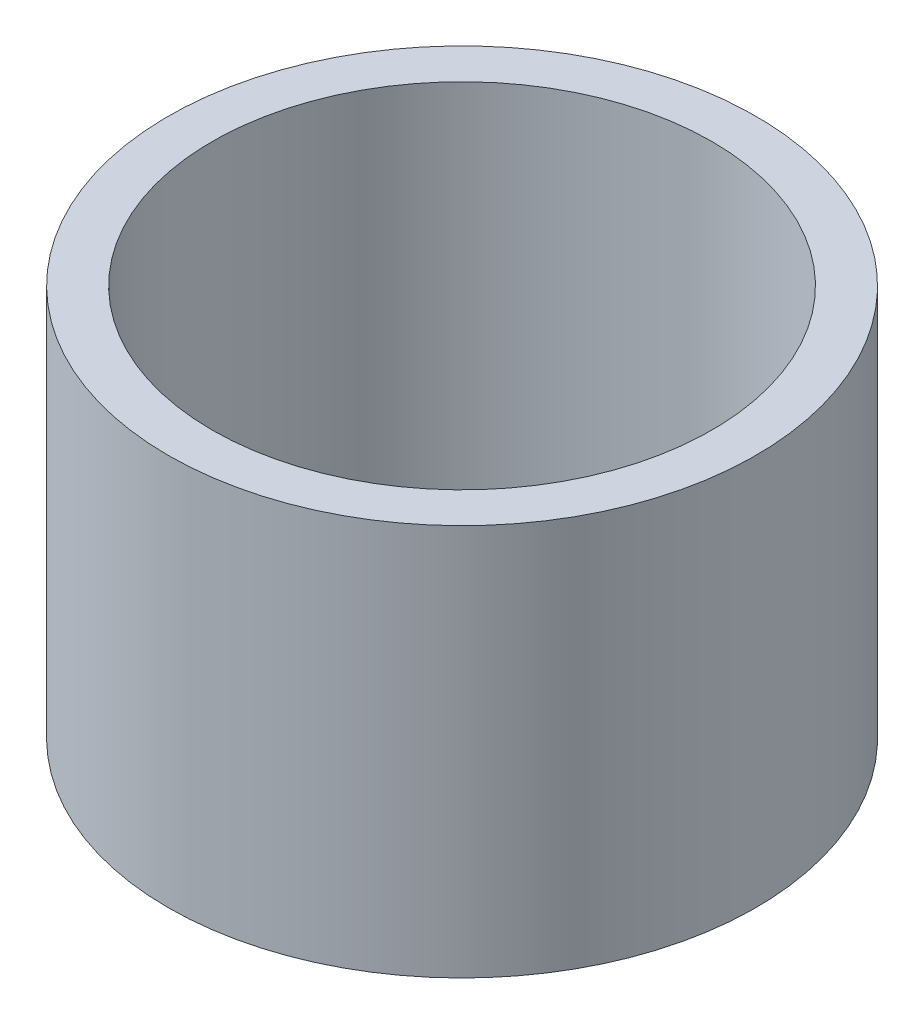
ISO-10303-21;
HEADER;
FILE_DESCRIPTION(('STEP AP214'),'2;1');
FILE_NAME('part.step','',(''),(''),'','','');
FILE_SCHEMA(('AUTOMOTIVE_DESIGN { 1 0 10303 214 1 1 1 1 }'));
ENDSEC;
DATA;
#1=APPLICATION_CONTEXT('core data for automotive mechanical design processes');
#2=APPLICATION_PROTOCOL_DEFINITION('international standard','automotive_design',2000,#1);
#3=PRODUCT_CONTEXT('',#1,'mechanical');
#4=PRODUCT('Part','Part','',(#3));
#5=PRODUCT_RELATED_PRODUCT_CATEGORY('part','',(#4));
#6=PRODUCT_DEFINITION_FORMATION('','',#4);
#7=PRODUCT_DEFINITION_CONTEXT('part definition',#1,'design');
#8=PRODUCT_DEFINITION('design','',#6,#7);
#9=PRODUCT_DEFINITION_SHAPE('','',#8);
#10=(LENGTH_UNIT() NAMED_UNIT(*) SI_UNIT(.MILLI.,.METRE.));
#11=(NAMED_UNIT(*) PLANE_ANGLE_UNIT() SI_UNIT($,.RADIAN.));
#12=(NAMED_UNIT(*) SI_UNIT($,.STERADIAN.) SOLID_ANGLE_UNIT());
#13=UNCERTAINTY_MEASURE_WITH_UNIT(LENGTH_MEASURE(1.E-05),#10,'distance_accuracy_value','');
#14=(GEOMETRIC_REPRESENTATION_CONTEXT(3) GLOBAL_UNCERTAINTY_ASSIGNED_CONTEXT((#13)) GLOBAL_UNIT_ASSIGNED_CONTEXT((#10,
#11,#12)) REPRESENTATION_CONTEXT('',''));
#15=CARTESIAN_POINT('',(0.,0.,0.));
#16=DIRECTION('',(0.,0.,1.));
#17=DIRECTION('',(1.,0.,0.));
#18=AXIS2_PLACEMENT_3D('',#15,#16,#17);
#19=CARTESIAN_POINT('',(0.,6.35,0.));
#20=DIRECTION('',(0.,1.,0.));
#21=DIRECTION('',(0.,0.,1.));
#22=AXIS2_PLACEMENT_3D('',#19,#20,#21);
#23=PLANE('',#22);
#24=CARTESIAN_POINT('',(0.,6.35,0.));
#25=DIRECTION('',(0.,1.,0.));
#26=DIRECTION('',(0.,0.,1.));
#27=AXIS2_PLACEMENT_3D('',#24,#25,#26);
#28=CIRCLE('',#27,4.7625);
#29=CARTESIAN_POINT('',(0.,6.35,4.7625));
#30=VERTEX_POINT('',#29);
#31=EDGE_CURVE('E10',#30,#30,#28,.T.);
#32=ORIENTED_EDGE('',*,*,#31,.T.);
#33=EDGE_LOOP('',(#32));
#34=FACE_BOUND('',#33,.T.);
#35=CARTESIAN_POINT('',(0.,6.35,0.));
#36=DIRECTION('',(0.,1.,0.));
#37=DIRECTION('',(0.,0.,1.));
#38=AXIS2_PLACEMENT_3D('',#35,#36,#37);
#39=CIRCLE('',#38,4.0513);
#40=CARTESIAN_POINT('',(0.,6.35,4.0513));
#41=VERTEX_POINT('',#40);
#42=EDGE_CURVE('E42',#41,#41,#39,.T.);
#43=ORIENTED_EDGE('',*,*,#42,.F.);
#44=EDGE_LOOP('',(#43));
#45=FACE_BOUND('',#44,.T.);
#46=ADVANCED_FACE('F31',(#34,#45),#23,.T.);
#47=CARTESIAN_POINT('',(0.,0.,0.));
#48=DIRECTION('',(0.,1.,0.));
#49=DIRECTION('',(0.,0.,1.));
#50=AXIS2_PLACEMENT_3D('',#47,#48,#49);
#51=PLANE('',#50);
#52=CARTESIAN_POINT('',(0.,0.,0.));
#53=DIRECTION('',(0.,1.,0.));
#54=DIRECTION('',(0.,0.,1.));
#55=AXIS2_PLACEMENT_3D('',#52,#53,#54);
#56=CIRCLE('',#55,4.7625);
#57=CARTESIAN_POINT('',(0.,0.,4.7625));
#58=VERTEX_POINT('',#57);
#59=EDGE_CURVE('E35',#58,#58,#56,.T.);
#60=ORIENTED_EDGE('',*,*,#59,.F.);
#61=EDGE_LOOP('',(#60));
#62=FACE_BOUND('',#61,.T.);
#63=CARTESIAN_POINT('',(0.,0.,0.));
#64=DIRECTION('',(0.,1.,0.));
#65=DIRECTION('',(0.,0.,1.));
#66=AXIS2_PLACEMENT_3D('',#63,#64,#65);
#67=CIRCLE('',#66,4.0513);
#68=CARTESIAN_POINT('',(0.,0.,4.0513));
#69=VERTEX_POINT('',#68);
#70=EDGE_CURVE('E44',#69,#69,#67,.T.);
#71=ORIENTED_EDGE('',*,*,#70,.T.);
#72=EDGE_LOOP('',(#71));
#73=FACE_BOUND('',#72,.T.);
#74=ADVANCED_FACE('F54',(#62,#73),#51,.F.);
#75=CARTESIAN_POINT('',(0.,6.35,0.));
#76=DIRECTION('',(0.,-1.,0.));
#77=DIRECTION('',(0.,0.,-1.));
#78=AXIS2_PLACEMENT_3D('',#75,#76,#77);
#79=CYLINDRICAL_SURFACE('',#78,4.7625);
#80=ORIENTED_EDGE('',*,*,#31,.F.);
#81=EDGE_LOOP('',(#80));
#82=FACE_BOUND('',#81,.T.);
#83=ORIENTED_EDGE('',*,*,#59,.T.);
#84=EDGE_LOOP('',(#83));
#85=FACE_BOUND('',#84,.T.);
#86=ADVANCED_FACE('F33',(#82,#85),#79,.T.);
#87=CARTESIAN_POINT('',(0.,6.35,0.));
#88=DIRECTION('',(0.,-1.,0.));
#89=DIRECTION('',(0.,0.,-1.));
#90=AXIS2_PLACEMENT_3D('',#87,#88,#89);
#91=CYLINDRICAL_SURFACE('',#90,4.0513);
#92=ORIENTED_EDGE('',*,*,#42,.T.);
#93=EDGE_LOOP('',(#92));
#94=FACE_BOUND('',#93,.T.);
#95=ORIENTED_EDGE('',*,*,#70,.F.);
#96=EDGE_LOOP('',(#95));
#97=FACE_BOUND('',#96,.T.);
#98=ADVANCED_FACE('F50',(#94,#97),#91,.F.);
#99=CLOSED_SHELL('',(#46,#74,#86,#98));
#100=MANIFOLD_SOLID_BREP('B2',#99);
#101=ADVANCED_BREP_SHAPE_REPRESENTATION('',(#18,#100),#14);
#102=SHAPE_DEFINITION_REPRESENTATION(#9,#101);
ENDSEC;
END-ISO-10303-21;
